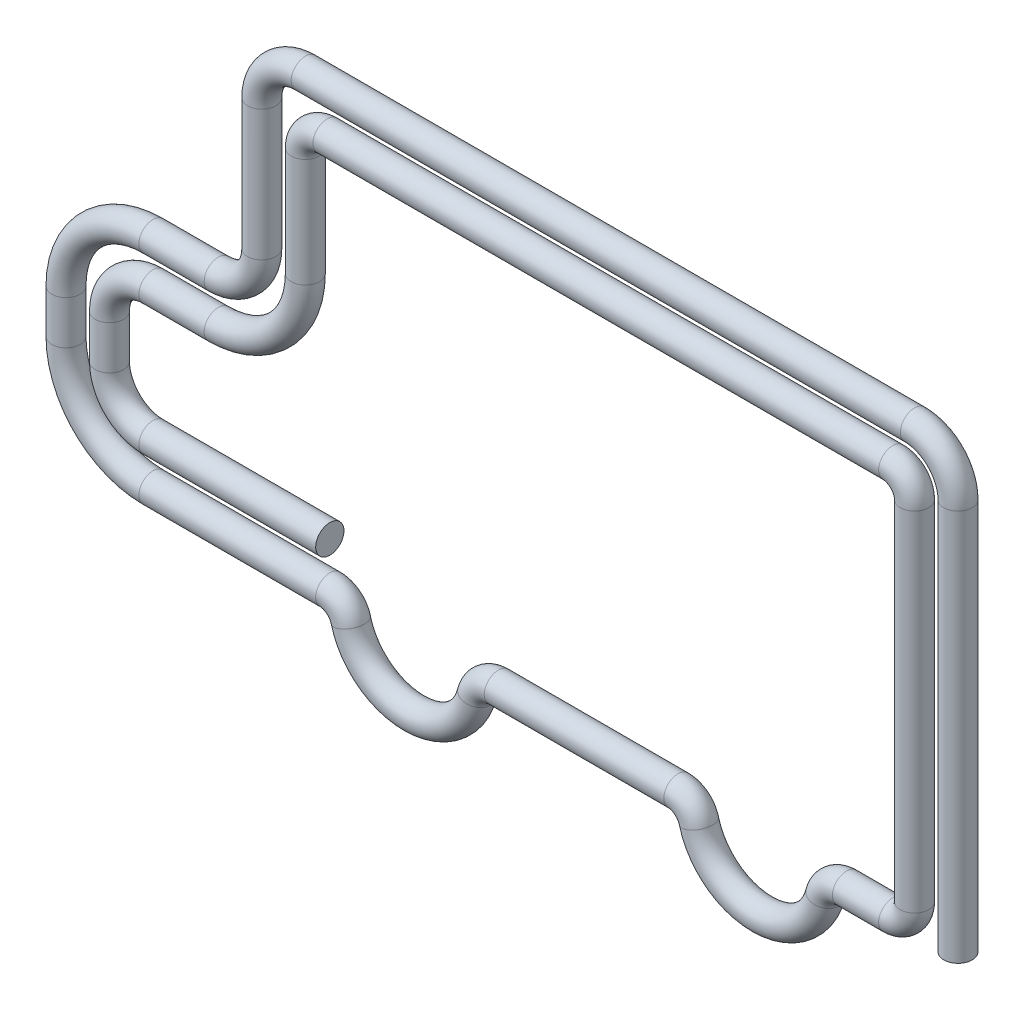
ISO-10303-21;
HEADER;
FILE_DESCRIPTION(('STEP AP214'),'2;1');
FILE_NAME('part.step','',(''),(''),'','','');
FILE_SCHEMA(('AUTOMOTIVE_DESIGN { 1 0 10303 214 1 1 1 1 }'));
ENDSEC;
DATA;
#1=APPLICATION_CONTEXT('core data for automotive mechanical design processes');
#2=APPLICATION_PROTOCOL_DEFINITION('international standard','automotive_design',2000,#1);
#3=PRODUCT_CONTEXT('',#1,'mechanical');
#4=PRODUCT('Part','Part','',(#3));
#5=PRODUCT_RELATED_PRODUCT_CATEGORY('part','',(#4));
#6=PRODUCT_DEFINITION_FORMATION('','',#4);
#7=PRODUCT_DEFINITION_CONTEXT('part definition',#1,'design');
#8=PRODUCT_DEFINITION('design','',#6,#7);
#9=PRODUCT_DEFINITION_SHAPE('','',#8);
#10=(LENGTH_UNIT() NAMED_UNIT(*) SI_UNIT(.MILLI.,.METRE.));
#11=(NAMED_UNIT(*) PLANE_ANGLE_UNIT() SI_UNIT($,.RADIAN.));
#12=(NAMED_UNIT(*) SI_UNIT($,.STERADIAN.) SOLID_ANGLE_UNIT());
#13=UNCERTAINTY_MEASURE_WITH_UNIT(LENGTH_MEASURE(1.E-05),#10,'distance_accuracy_value','');
#14=(GEOMETRIC_REPRESENTATION_CONTEXT(3) GLOBAL_UNCERTAINTY_ASSIGNED_CONTEXT((#13)) GLOBAL_UNIT_ASSIGNED_CONTEXT((#10,
#11,#12)) REPRESENTATION_CONTEXT('',''));
#15=CARTESIAN_POINT('',(0.,0.,0.));
#16=DIRECTION('',(0.,0.,1.));
#17=DIRECTION('',(1.,0.,0.));
#18=AXIS2_PLACEMENT_3D('',#15,#16,#17);
#19=CARTESIAN_POINT('',(-20.,-8.00000000000001,0.));
#20=DIRECTION('',(1.,0.,0.));
#21=DIRECTION('',(0.,1.,0.));
#22=AXIS2_PLACEMENT_3D('',#19,#20,#21);
#23=CYLINDRICAL_SURFACE('',#22,0.650000000000001);
#24=CARTESIAN_POINT('',(-20.,-8.00000000000001,0.));
#25=DIRECTION('',(-1.,-1.12581485517702E-13,0.));
#26=DIRECTION('',(1.12581485517702E-13,-1.,0.));
#27=AXIS2_PLACEMENT_3D('',#24,#25,#26);
#28=CIRCLE('',#27,0.650000000000001);
#29=CARTESIAN_POINT('',(-20.,-8.65000000000001,0.));
#30=VERTEX_POINT('',#29);
#31=EDGE_CURVE('E39',#30,#30,#28,.T.);
#32=ORIENTED_EDGE('',*,*,#31,.F.);
#33=EDGE_LOOP('',(#32));
#34=FACE_BOUND('',#33,.T.);
#35=CARTESIAN_POINT('',(-11.8729833462074,-8.00000000000001,0.));
#36=DIRECTION('',(-1.,-1.12581485517702E-13,0.));
#37=DIRECTION('',(1.12581485517702E-13,-1.,0.));
#38=AXIS2_PLACEMENT_3D('',#35,#36,#37);
#39=CIRCLE('',#38,0.650000000000001);
#40=CARTESIAN_POINT('',(-11.8729833462074,-8.65000000000001,0.));
#41=VERTEX_POINT('',#40);
#42=EDGE_CURVE('E10',#41,#41,#39,.T.);
#43=ORIENTED_EDGE('',*,*,#42,.T.);
#44=EDGE_LOOP('',(#43));
#45=FACE_BOUND('',#44,.T.);
#46=ADVANCED_FACE('F33',(#34,#45),#23,.T.);
#47=CARTESIAN_POINT('',(-20.,-6.,0.));
#48=DIRECTION('',(0.,0.,1.));
#49=DIRECTION('',(1.,0.,0.));
#50=AXIS2_PLACEMENT_3D('',#47,#48,#49);
#51=TOROIDAL_SURFACE('',#50,2.00000000000001,0.650000000000001);
#52=CARTESIAN_POINT('',(-22.,-5.99999999999997,0.));
#53=DIRECTION('',(0.,1.,0.));
#54=DIRECTION('',(-1.,0.,0.));
#55=AXIS2_PLACEMENT_3D('',#52,#53,#54);
#56=CIRCLE('',#55,0.650000000000001);
#57=CARTESIAN_POINT('',(-22.65,-5.99999999999995,0.));
#58=VERTEX_POINT('',#57);
#59=EDGE_CURVE('E43',#58,#58,#56,.T.);
#60=CARTESIAN_POINT('',(-20.,-6.,0.));
#61=DIRECTION('',(0.,0.,1.));
#62=DIRECTION('',(1.,0.,0.));
#63=AXIS2_PLACEMENT_3D('',#60,#61,#62);
#64=CIRCLE('',#63,2.65000000000001);
#65=EDGE_CURVE('',#58,#30,#64,.T.);
#66=ORIENTED_EDGE('',*,*,#59,.F.);
#67=ORIENTED_EDGE('',*,*,#31,.T.);
#68=ORIENTED_EDGE('',*,*,#65,.T.);
#69=ORIENTED_EDGE('',*,*,#65,.F.);
#70=EDGE_LOOP('',(#66,#68,#67,#69));
#71=FACE_BOUND('',#70,.T.);
#72=ADVANCED_FACE('F305',(#71),#51,.T.);
#73=CARTESIAN_POINT('',(-22.,-4.,0.));
#74=DIRECTION('',(0.,-1.,0.));
#75=DIRECTION('',(0.,0.,-1.));
#76=AXIS2_PLACEMENT_3D('',#73,#74,#75);
#77=CYLINDRICAL_SURFACE('',#76,0.650000000000001);
#78=CARTESIAN_POINT('',(-22.,-4.,0.));
#79=DIRECTION('',(0.,1.,0.));
#80=DIRECTION('',(-1.,0.,0.));
#81=AXIS2_PLACEMENT_3D('',#78,#79,#80);
#82=CIRCLE('',#81,0.650000000000001);
#83=CARTESIAN_POINT('',(-22.65,-4.,0.));
#84=VERTEX_POINT('',#83);
#85=EDGE_CURVE('E47',#84,#84,#82,.T.);
#86=ORIENTED_EDGE('',*,*,#85,.F.);
#87=EDGE_LOOP('',(#86));
#88=FACE_BOUND('',#87,.T.);
#89=ORIENTED_EDGE('',*,*,#59,.T.);
#90=EDGE_LOOP('',(#89));
#91=FACE_BOUND('',#90,.T.);
#92=ADVANCED_FACE('F299',(#88,#91),#77,.T.);
#93=CARTESIAN_POINT('',(-20.,-4.,0.));
#94=DIRECTION('',(0.,0.,1.));
#95=DIRECTION('',(1.,0.,0.));
#96=AXIS2_PLACEMENT_3D('',#93,#94,#95);
#97=TOROIDAL_SURFACE('',#96,2.00000000000001,0.650000000000001);
#98=CARTESIAN_POINT('',(-20.,-1.99999999999999,0.));
#99=DIRECTION('',(1.,0.,0.));
#100=DIRECTION('',(0.,1.,0.));
#101=AXIS2_PLACEMENT_3D('',#98,#99,#100);
#102=CIRCLE('',#101,0.650000000000001);
#103=CARTESIAN_POINT('',(-19.9999999999999,-1.34999999999999,0.));
#104=VERTEX_POINT('',#103);
#105=EDGE_CURVE('E52',#104,#104,#102,.T.);
#106=CARTESIAN_POINT('',(-20.,-4.,0.));
#107=DIRECTION('',(0.,0.,1.));
#108=DIRECTION('',(1.,0.,0.));
#109=AXIS2_PLACEMENT_3D('',#106,#107,#108);
#110=CIRCLE('',#109,2.65000000000001);
#111=EDGE_CURVE('',#104,#84,#110,.T.);
#112=ORIENTED_EDGE('',*,*,#105,.F.);
#113=ORIENTED_EDGE('',*,*,#85,.T.);
#114=ORIENTED_EDGE('',*,*,#111,.T.);
#115=ORIENTED_EDGE('',*,*,#111,.F.);
#116=EDGE_LOOP('',(#112,#114,#113,#115));
#117=FACE_BOUND('',#116,.T.);
#118=ADVANCED_FACE('F293',(#117),#97,.T.);
#119=CARTESIAN_POINT('',(-17.,-1.99999999999999,0.));
#120=DIRECTION('',(-1.,0.,0.));
#121=DIRECTION('',(0.,0.,1.));
#122=AXIS2_PLACEMENT_3D('',#119,#120,#121);
#123=CYLINDRICAL_SURFACE('',#122,0.650000000000001);
#124=CARTESIAN_POINT('',(-17.,-1.99999999999999,0.));
#125=DIRECTION('',(1.,0.,0.));
#126=DIRECTION('',(0.,1.,0.));
#127=AXIS2_PLACEMENT_3D('',#124,#125,#126);
#128=CIRCLE('',#127,0.650000000000001);
#129=CARTESIAN_POINT('',(-17.,-2.65,0.));
#130=VERTEX_POINT('',#129);
#131=EDGE_CURVE('E55',#130,#130,#128,.T.);
#132=ORIENTED_EDGE('',*,*,#131,.F.);
#133=EDGE_LOOP('',(#132));
#134=FACE_BOUND('',#133,.T.);
#135=ORIENTED_EDGE('',*,*,#105,.T.);
#136=EDGE_LOOP('',(#135));
#137=FACE_BOUND('',#136,.T.);
#138=ADVANCED_FACE('F287',(#134,#137),#123,.T.);
#139=CARTESIAN_POINT('',(-17.,2.,0.));
#140=DIRECTION('',(0.,0.,-1.));
#141=DIRECTION('',(-1.,0.,0.));
#142=AXIS2_PLACEMENT_3D('',#139,#140,#141);
#143=TOROIDAL_SURFACE('',#142,3.99999999999999,0.650000000000001);
#144=CARTESIAN_POINT('',(-13.,2.00000000000002,0.));
#145=DIRECTION('',(0.,1.,0.));
#146=DIRECTION('',(-1.,0.,0.));
#147=AXIS2_PLACEMENT_3D('',#144,#145,#146);
#148=CIRCLE('',#147,0.650000000000001);
#149=CARTESIAN_POINT('',(-12.35,2.00000000000003,0.));
#150=VERTEX_POINT('',#149);
#151=EDGE_CURVE('E58',#150,#150,#148,.T.);
#152=CARTESIAN_POINT('',(-17.,2.,0.));
#153=DIRECTION('',(0.,0.,-1.));
#154=DIRECTION('',(-1.,0.,0.));
#155=AXIS2_PLACEMENT_3D('',#152,#153,#154);
#156=CIRCLE('',#155,4.64999999999999);
#157=EDGE_CURVE('',#150,#130,#156,.T.);
#158=ORIENTED_EDGE('',*,*,#151,.F.);
#159=ORIENTED_EDGE('',*,*,#131,.T.);
#160=ORIENTED_EDGE('',*,*,#157,.T.);
#161=ORIENTED_EDGE('',*,*,#157,.F.);
#162=EDGE_LOOP('',(#158,#160,#159,#161));
#163=FACE_BOUND('',#162,.T.);
#164=ADVANCED_FACE('F281',(#163),#143,.T.);
#165=CARTESIAN_POINT('',(-13.,6.99999999999999,0.));
#166=DIRECTION('',(0.,-1.,0.));
#167=DIRECTION('',(0.,0.,-1.));
#168=AXIS2_PLACEMENT_3D('',#165,#166,#167);
#169=CYLINDRICAL_SURFACE('',#168,0.650000000000001);
#170=CARTESIAN_POINT('',(-13.,6.99999999999999,0.));
#171=DIRECTION('',(0.,1.,0.));
#172=DIRECTION('',(-1.,0.,0.));
#173=AXIS2_PLACEMENT_3D('',#170,#171,#172);
#174=CIRCLE('',#173,0.650000000000001);
#175=CARTESIAN_POINT('',(-13.65,6.99999999999999,0.));
#176=VERTEX_POINT('',#175);
#177=EDGE_CURVE('E61',#176,#176,#174,.T.);
#178=ORIENTED_EDGE('',*,*,#177,.F.);
#179=EDGE_LOOP('',(#178));
#180=FACE_BOUND('',#179,.T.);
#181=ORIENTED_EDGE('',*,*,#151,.T.);
#182=EDGE_LOOP('',(#181));
#183=FACE_BOUND('',#182,.T.);
#184=ADVANCED_FACE('F275',(#180,#183),#169,.T.);
#185=CARTESIAN_POINT('',(-12.,6.99999999999999,0.));
#186=DIRECTION('',(0.,0.,1.));
#187=DIRECTION('',(1.,0.,0.));
#188=AXIS2_PLACEMENT_3D('',#185,#186,#187);
#189=TOROIDAL_SURFACE('',#188,1.00000000000001,0.650000000000001);
#190=CARTESIAN_POINT('',(-12.,7.99999999999999,0.));
#191=DIRECTION('',(1.,0.,0.));
#192=DIRECTION('',(0.,1.,0.));
#193=AXIS2_PLACEMENT_3D('',#190,#191,#192);
#194=CIRCLE('',#193,0.650000000000001);
#195=CARTESIAN_POINT('',(-12.,8.65,0.));
#196=VERTEX_POINT('',#195);
#197=EDGE_CURVE('E64',#196,#196,#194,.T.);
#198=CARTESIAN_POINT('',(-12.,6.99999999999999,0.));
#199=DIRECTION('',(0.,0.,1.));
#200=DIRECTION('',(1.,0.,0.));
#201=AXIS2_PLACEMENT_3D('',#198,#199,#200);
#202=CIRCLE('',#201,1.65000000000001);
#203=EDGE_CURVE('',#196,#176,#202,.T.);
#204=ORIENTED_EDGE('',*,*,#197,.F.);
#205=ORIENTED_EDGE('',*,*,#177,.T.);
#206=ORIENTED_EDGE('',*,*,#203,.T.);
#207=ORIENTED_EDGE('',*,*,#203,.F.);
#208=EDGE_LOOP('',(#204,#206,#205,#207));
#209=FACE_BOUND('',#208,.T.);
#210=ADVANCED_FACE('F269',(#209),#189,.T.);
#211=CARTESIAN_POINT('',(14.,8.00000000000001,0.));
#212=DIRECTION('',(-1.,0.,0.));
#213=DIRECTION('',(0.,-1.,0.));
#214=AXIS2_PLACEMENT_3D('',#211,#212,#213);
#215=CYLINDRICAL_SURFACE('',#214,0.650000000000001);
#216=CARTESIAN_POINT('',(14.,8.00000000000001,0.));
#217=DIRECTION('',(1.,0.,0.));
#218=DIRECTION('',(0.,1.,0.));
#219=AXIS2_PLACEMENT_3D('',#216,#217,#218);
#220=CIRCLE('',#219,0.650000000000001);
#221=CARTESIAN_POINT('',(14.,8.65000000000001,0.));
#222=VERTEX_POINT('',#221);
#223=EDGE_CURVE('E67',#222,#222,#220,.T.);
#224=ORIENTED_EDGE('',*,*,#223,.F.);
#225=EDGE_LOOP('',(#224));
#226=FACE_BOUND('',#225,.T.);
#227=ORIENTED_EDGE('',*,*,#197,.T.);
#228=EDGE_LOOP('',(#227));
#229=FACE_BOUND('',#228,.T.);
#230=ADVANCED_FACE('F263',(#226,#229),#215,.T.);
#231=CARTESIAN_POINT('',(14.,7.,0.));
#232=DIRECTION('',(0.,0.,1.));
#233=DIRECTION('',(1.,0.,0.));
#234=AXIS2_PLACEMENT_3D('',#231,#232,#233);
#235=TOROIDAL_SURFACE('',#234,1.00000000000001,0.650000000000001);
#236=CARTESIAN_POINT('',(15.,6.99999999999998,0.));
#237=DIRECTION('',(0.,-1.,0.));
#238=DIRECTION('',(1.,0.,0.));
#239=AXIS2_PLACEMENT_3D('',#236,#237,#238);
#240=CIRCLE('',#239,0.650000000000001);
#241=CARTESIAN_POINT('',(15.65,6.99999999999997,0.));
#242=VERTEX_POINT('',#241);
#243=EDGE_CURVE('E70',#242,#242,#240,.T.);
#244=CARTESIAN_POINT('',(14.,7.,0.));
#245=DIRECTION('',(0.,0.,1.));
#246=DIRECTION('',(1.,0.,0.));
#247=AXIS2_PLACEMENT_3D('',#244,#245,#246);
#248=CIRCLE('',#247,1.65000000000001);
#249=EDGE_CURVE('',#242,#222,#248,.T.);
#250=ORIENTED_EDGE('',*,*,#243,.F.);
#251=ORIENTED_EDGE('',*,*,#223,.T.);
#252=ORIENTED_EDGE('',*,*,#249,.T.);
#253=ORIENTED_EDGE('',*,*,#249,.F.);
#254=EDGE_LOOP('',(#250,#252,#251,#253));
#255=FACE_BOUND('',#254,.T.);
#256=ADVANCED_FACE('F257',(#255),#235,.T.);
#257=CARTESIAN_POINT('',(15.,-9.00000000000001,0.));
#258=DIRECTION('',(0.,1.,0.));
#259=DIRECTION('',(-1.,0.,0.));
#260=AXIS2_PLACEMENT_3D('',#257,#258,#259);
#261=CYLINDRICAL_SURFACE('',#260,0.650000000000001);
#262=CARTESIAN_POINT('',(15.,-9.00000000000001,0.));
#263=DIRECTION('',(0.,-1.,0.));
#264=DIRECTION('',(1.,0.,0.));
#265=AXIS2_PLACEMENT_3D('',#262,#263,#264);
#266=CIRCLE('',#265,0.650000000000001);
#267=CARTESIAN_POINT('',(15.65,-9.00000000000001,0.));
#268=VERTEX_POINT('',#267);
#269=EDGE_CURVE('E73',#268,#268,#266,.T.);
#270=ORIENTED_EDGE('',*,*,#269,.F.);
#271=EDGE_LOOP('',(#270));
#272=FACE_BOUND('',#271,.T.);
#273=ORIENTED_EDGE('',*,*,#243,.T.);
#274=EDGE_LOOP('',(#273));
#275=FACE_BOUND('',#274,.T.);
#276=ADVANCED_FACE('F251',(#272,#275),#261,.T.);
#277=CARTESIAN_POINT('',(14.,-9.,0.));
#278=DIRECTION('',(0.,0.,1.));
#279=DIRECTION('',(1.,0.,0.));
#280=AXIS2_PLACEMENT_3D('',#277,#278,#279);
#281=TOROIDAL_SURFACE('',#280,1.00000000000001,0.650000000000001);
#282=CARTESIAN_POINT('',(14.,-10.,0.));
#283=DIRECTION('',(-1.,0.,0.));
#284=DIRECTION('',(0.,-1.,0.));
#285=AXIS2_PLACEMENT_3D('',#282,#283,#284);
#286=CIRCLE('',#285,0.650000000000001);
#287=CARTESIAN_POINT('',(14.,-10.65,0.));
#288=VERTEX_POINT('',#287);
#289=EDGE_CURVE('E76',#288,#288,#286,.T.);
#290=CARTESIAN_POINT('',(14.,-9.,0.));
#291=DIRECTION('',(0.,0.,1.));
#292=DIRECTION('',(1.,0.,0.));
#293=AXIS2_PLACEMENT_3D('',#290,#291,#292);
#294=CIRCLE('',#293,1.65000000000001);
#295=EDGE_CURVE('',#288,#268,#294,.T.);
#296=ORIENTED_EDGE('',*,*,#289,.F.);
#297=ORIENTED_EDGE('',*,*,#269,.T.);
#298=ORIENTED_EDGE('',*,*,#295,.T.);
#299=ORIENTED_EDGE('',*,*,#295,.F.);
#300=EDGE_LOOP('',(#296,#298,#297,#299));
#301=FACE_BOUND('',#300,.T.);
#302=ADVANCED_FACE('F245',(#301),#281,.T.);
#303=CARTESIAN_POINT('',(11.8729833462074,-10.,0.));
#304=DIRECTION('',(1.,0.,0.));
#305=DIRECTION('',(0.,1.,0.));
#306=AXIS2_PLACEMENT_3D('',#303,#304,#305);
#307=CYLINDRICAL_SURFACE('',#306,0.650000000000001);
#308=CARTESIAN_POINT('',(11.8729833462074,-10.,0.));
#309=DIRECTION('',(-1.,0.,0.));
#310=DIRECTION('',(0.,-1.,0.));
#311=AXIS2_PLACEMENT_3D('',#308,#309,#310);
#312=CIRCLE('',#311,0.650000000000001);
#313=CARTESIAN_POINT('',(11.8729833462074,-9.35000000000001,0.));
#314=VERTEX_POINT('',#313);
#315=EDGE_CURVE('E79',#314,#314,#312,.T.);
#316=ORIENTED_EDGE('',*,*,#315,.F.);
#317=EDGE_LOOP('',(#316));
#318=FACE_BOUND('',#317,.T.);
#319=ORIENTED_EDGE('',*,*,#289,.T.);
#320=EDGE_LOOP('',(#319));
#321=FACE_BOUND('',#320,.T.);
#322=ADVANCED_FACE('F239',(#318,#321),#307,.T.);
#323=CARTESIAN_POINT('',(11.8729833462074,-11.,0.));
#324=DIRECTION('',(0.,0.,-1.));
#325=DIRECTION('',(-1.,0.,0.));
#326=AXIS2_PLACEMENT_3D('',#323,#324,#325);
#327=TOROIDAL_SURFACE('',#326,0.999999999999993,0.650000000000001);
#328=CARTESIAN_POINT('',(10.9047375096556,-10.75,0.));
#329=DIRECTION('',(-0.24999999999996,-0.968245836551865,0.));
#330=DIRECTION('',(0.968245836551865,-0.24999999999996,0.));
#331=AXIS2_PLACEMENT_3D('',#328,#329,#330);
#332=CIRCLE('',#331,0.650000000000001);
#333=CARTESIAN_POINT('',(10.2753777158969,-10.5875,0.));
#334=VERTEX_POINT('',#333);
#335=EDGE_CURVE('E82',#334,#334,#332,.T.);
#336=CARTESIAN_POINT('',(11.8729833462074,-11.,0.));
#337=DIRECTION('',(0.,0.,-1.));
#338=DIRECTION('',(-1.,0.,0.));
#339=AXIS2_PLACEMENT_3D('',#336,#337,#338);
#340=CIRCLE('',#339,1.64999999999999);
#341=EDGE_CURVE('',#334,#314,#340,.T.);
#342=ORIENTED_EDGE('',*,*,#335,.F.);
#343=ORIENTED_EDGE('',*,*,#315,.T.);
#344=ORIENTED_EDGE('',*,*,#341,.T.);
#345=ORIENTED_EDGE('',*,*,#341,.F.);
#346=EDGE_LOOP('',(#342,#344,#343,#345));
#347=FACE_BOUND('',#346,.T.);
#348=ADVANCED_FACE('F233',(#347),#327,.T.);
#349=CARTESIAN_POINT('',(8.,-10.,0.));
#350=DIRECTION('',(0.,0.,1.));
#351=DIRECTION('',(1.,0.,0.));
#352=AXIS2_PLACEMENT_3D('',#349,#350,#351);
#353=TOROIDAL_SURFACE('',#352,3.00000000000001,0.650000000000001);
#354=CARTESIAN_POINT('',(5.09526249034442,-10.75,0.));
#355=DIRECTION('',(-0.25000000000004,0.968245836551844,0.));
#356=DIRECTION('',(-0.968245836551844,-0.25000000000004,0.));
#357=AXIS2_PLACEMENT_3D('',#354,#355,#356);
#358=CIRCLE('',#357,0.650000000000001);
#359=CARTESIAN_POINT('',(5.72462228410313,-10.5875,0.));
#360=VERTEX_POINT('',#359);
#361=EDGE_CURVE('E85',#360,#360,#358,.T.);
#362=ORIENTED_EDGE('',*,*,#361,.F.);
#363=EDGE_LOOP('',(#362));
#364=FACE_BOUND('',#363,.T.);
#365=ORIENTED_EDGE('',*,*,#335,.T.);
#366=EDGE_LOOP('',(#365));
#367=FACE_BOUND('',#366,.T.);
#368=ADVANCED_FACE('F227',(#364,#367),#353,.T.);
#369=CARTESIAN_POINT('',(4.12701665379258,-11.,0.));
#370=DIRECTION('',(0.,0.,-1.));
#371=DIRECTION('',(-1.,0.,0.));
#372=AXIS2_PLACEMENT_3D('',#369,#370,#371);
#373=TOROIDAL_SURFACE('',#372,0.999999999999994,0.650000000000001);
#374=CARTESIAN_POINT('',(4.12701665379257,-10.,0.));
#375=DIRECTION('',(-1.,0.,0.));
#376=DIRECTION('',(0.,-1.,0.));
#377=AXIS2_PLACEMENT_3D('',#374,#375,#376);
#378=CIRCLE('',#377,0.650000000000001);
#379=CARTESIAN_POINT('',(4.12701665379256,-9.35000000000001,0.));
#380=VERTEX_POINT('',#379);
#381=EDGE_CURVE('E88',#380,#380,#378,.T.);
#382=CARTESIAN_POINT('',(4.12701665379258,-11.,0.));
#383=DIRECTION('',(0.,0.,-1.));
#384=DIRECTION('',(-1.,0.,0.));
#385=AXIS2_PLACEMENT_3D('',#382,#383,#384);
#386=CIRCLE('',#385,1.64999999999999);
#387=EDGE_CURVE('',#380,#360,#386,.T.);
#388=ORIENTED_EDGE('',*,*,#381,.F.);
#389=ORIENTED_EDGE('',*,*,#361,.T.);
#390=ORIENTED_EDGE('',*,*,#387,.T.);
#391=ORIENTED_EDGE('',*,*,#387,.F.);
#392=EDGE_LOOP('',(#388,#390,#389,#391));
#393=FACE_BOUND('',#392,.T.);
#394=ADVANCED_FACE('F221',(#393),#373,.T.);
#395=CARTESIAN_POINT('',(-4.12701665379259,-10.,0.));
#396=DIRECTION('',(1.,0.,0.));
#397=DIRECTION('',(0.,0.,-1.));
#398=AXIS2_PLACEMENT_3D('',#395,#396,#397);
#399=CYLINDRICAL_SURFACE('',#398,0.650000000000001);
#400=CARTESIAN_POINT('',(-4.12701665379259,-10.,0.));
#401=DIRECTION('',(-1.,0.,0.));
#402=DIRECTION('',(0.,-1.,0.));
#403=AXIS2_PLACEMENT_3D('',#400,#401,#402);
#404=CIRCLE('',#403,0.650000000000001);
#405=CARTESIAN_POINT('',(-4.1270166537926,-9.35000000000001,0.));
#406=VERTEX_POINT('',#405);
#407=EDGE_CURVE('E91',#406,#406,#404,.T.);
#408=ORIENTED_EDGE('',*,*,#407,.F.);
#409=EDGE_LOOP('',(#408));
#410=FACE_BOUND('',#409,.T.);
#411=ORIENTED_EDGE('',*,*,#381,.T.);
#412=EDGE_LOOP('',(#411));
#413=FACE_BOUND('',#412,.T.);
#414=ADVANCED_FACE('F215',(#410,#413),#399,.T.);
#415=CARTESIAN_POINT('',(-4.12701665379258,-11.,0.));
#416=DIRECTION('',(0.,0.,-1.));
#417=DIRECTION('',(-1.,0.,0.));
#418=AXIS2_PLACEMENT_3D('',#415,#416,#417);
#419=TOROIDAL_SURFACE('',#418,0.999999999999996,0.650000000000001);
#420=CARTESIAN_POINT('',(-5.09526249034444,-10.75,0.));
#421=DIRECTION('',(-0.249999999999959,-0.968245836551865,0.));
#422=DIRECTION('',(0.968245836551865,-0.249999999999959,0.));
#423=AXIS2_PLACEMENT_3D('',#420,#421,#422);
#424=CIRCLE('',#423,0.650000000000001);
#425=CARTESIAN_POINT('',(-5.72462228410314,-10.5875,0.));
#426=VERTEX_POINT('',#425);
#427=EDGE_CURVE('E94',#426,#426,#424,.T.);
#428=CARTESIAN_POINT('',(-4.12701665379258,-11.,0.));
#429=DIRECTION('',(0.,0.,-1.));
#430=DIRECTION('',(-1.,0.,0.));
#431=AXIS2_PLACEMENT_3D('',#428,#429,#430);
#432=CIRCLE('',#431,1.65);
#433=EDGE_CURVE('',#426,#406,#432,.T.);
#434=ORIENTED_EDGE('',*,*,#427,.F.);
#435=ORIENTED_EDGE('',*,*,#407,.T.);
#436=ORIENTED_EDGE('',*,*,#433,.T.);
#437=ORIENTED_EDGE('',*,*,#433,.F.);
#438=EDGE_LOOP('',(#434,#436,#435,#437));
#439=FACE_BOUND('',#438,.T.);
#440=ADVANCED_FACE('F209',(#439),#419,.T.);
#441=CARTESIAN_POINT('',(-8.,-10.,0.));
#442=DIRECTION('',(0.,0.,1.));
#443=DIRECTION('',(1.,0.,0.));
#444=AXIS2_PLACEMENT_3D('',#441,#442,#443);
#445=TOROIDAL_SURFACE('',#444,3.00000000000001,0.650000000000001);
#446=CARTESIAN_POINT('',(-10.9047375096556,-10.75,0.));
#447=DIRECTION('',(-0.25000000000004,0.968245836551844,0.));
#448=DIRECTION('',(-0.968245836551844,-0.25000000000004,0.));
#449=AXIS2_PLACEMENT_3D('',#446,#447,#448);
#450=CIRCLE('',#449,0.650000000000001);
#451=CARTESIAN_POINT('',(-10.2753777158969,-10.5875,0.));
#452=VERTEX_POINT('',#451);
#453=EDGE_CURVE('E97',#452,#452,#450,.T.);
#454=ORIENTED_EDGE('',*,*,#453,.F.);
#455=EDGE_LOOP('',(#454));
#456=FACE_BOUND('',#455,.T.);
#457=ORIENTED_EDGE('',*,*,#427,.T.);
#458=EDGE_LOOP('',(#457));
#459=FACE_BOUND('',#458,.T.);
#460=ADVANCED_FACE('F203',(#456,#459),#445,.T.);
#461=CARTESIAN_POINT('',(-11.8729833462074,-11.,0.));
#462=DIRECTION('',(0.,0.,-1.));
#463=DIRECTION('',(-1.,0.,0.));
#464=AXIS2_PLACEMENT_3D('',#461,#462,#463);
#465=TOROIDAL_SURFACE('',#464,0.999999999999996,0.650000000000001);
#466=CARTESIAN_POINT('',(-11.8729833462074,-10.,0.));
#467=DIRECTION('',(-1.,0.,0.));
#468=DIRECTION('',(0.,-1.,0.));
#469=AXIS2_PLACEMENT_3D('',#466,#467,#468);
#470=CIRCLE('',#469,0.650000000000001);
#471=CARTESIAN_POINT('',(-11.8729833462074,-9.35,0.));
#472=VERTEX_POINT('',#471);
#473=EDGE_CURVE('E100',#472,#472,#470,.T.);
#474=CARTESIAN_POINT('',(-11.8729833462074,-11.,0.));
#475=DIRECTION('',(0.,0.,-1.));
#476=DIRECTION('',(-1.,0.,0.));
#477=AXIS2_PLACEMENT_3D('',#474,#475,#476);
#478=CIRCLE('',#477,1.65);
#479=EDGE_CURVE('',#472,#452,#478,.T.);
#480=ORIENTED_EDGE('',*,*,#473,.F.);
#481=ORIENTED_EDGE('',*,*,#453,.T.);
#482=ORIENTED_EDGE('',*,*,#479,.T.);
#483=ORIENTED_EDGE('',*,*,#479,.F.);
#484=EDGE_LOOP('',(#480,#482,#481,#483));
#485=FACE_BOUND('',#484,.T.);
#486=ADVANCED_FACE('F197',(#485),#465,.T.);
#487=CARTESIAN_POINT('',(-20.,-10.,0.));
#488=DIRECTION('',(1.,0.,0.));
#489=DIRECTION('',(0.,1.,0.));
#490=AXIS2_PLACEMENT_3D('',#487,#488,#489);
#491=CYLINDRICAL_SURFACE('',#490,0.650000000000001);
#492=CARTESIAN_POINT('',(-20.,-10.,0.));
#493=DIRECTION('',(-1.,0.,0.));
#494=DIRECTION('',(0.,-1.,0.));
#495=AXIS2_PLACEMENT_3D('',#492,#493,#494);
#496=CIRCLE('',#495,0.650000000000001);
#497=CARTESIAN_POINT('',(-20.,-10.65,0.));
#498=VERTEX_POINT('',#497);
#499=EDGE_CURVE('E103',#498,#498,#496,.T.);
#500=ORIENTED_EDGE('',*,*,#499,.F.);
#501=EDGE_LOOP('',(#500));
#502=FACE_BOUND('',#501,.T.);
#503=ORIENTED_EDGE('',*,*,#473,.T.);
#504=EDGE_LOOP('',(#503));
#505=FACE_BOUND('',#504,.T.);
#506=ADVANCED_FACE('F191',(#502,#505),#491,.T.);
#507=CARTESIAN_POINT('',(-20.,-6.,0.));
#508=DIRECTION('',(0.,0.,1.));
#509=DIRECTION('',(1.,0.,0.));
#510=AXIS2_PLACEMENT_3D('',#507,#508,#509);
#511=TOROIDAL_SURFACE('',#510,4.,0.650000000000001);
#512=CARTESIAN_POINT('',(-24.,-5.99999999999997,0.));
#513=DIRECTION('',(0.,1.,0.));
#514=DIRECTION('',(-1.,0.,0.));
#515=AXIS2_PLACEMENT_3D('',#512,#513,#514);
#516=CIRCLE('',#515,0.650000000000001);
#517=CARTESIAN_POINT('',(-24.65,-5.99999999999997,0.));
#518=VERTEX_POINT('',#517);
#519=EDGE_CURVE('E106',#518,#518,#516,.T.);
#520=CARTESIAN_POINT('',(-20.,-6.,0.));
#521=DIRECTION('',(0.,0.,1.));
#522=DIRECTION('',(1.,0.,0.));
#523=AXIS2_PLACEMENT_3D('',#520,#521,#522);
#524=CIRCLE('',#523,4.65);
#525=EDGE_CURVE('',#518,#498,#524,.T.);
#526=ORIENTED_EDGE('',*,*,#519,.F.);
#527=ORIENTED_EDGE('',*,*,#499,.T.);
#528=ORIENTED_EDGE('',*,*,#525,.T.);
#529=ORIENTED_EDGE('',*,*,#525,.F.);
#530=EDGE_LOOP('',(#526,#528,#527,#529));
#531=FACE_BOUND('',#530,.T.);
#532=ADVANCED_FACE('F185',(#531),#511,.T.);
#533=CARTESIAN_POINT('',(-24.,-4.00000000000002,0.));
#534=DIRECTION('',(0.,-1.,0.));
#535=DIRECTION('',(0.,0.,-1.));
#536=AXIS2_PLACEMENT_3D('',#533,#534,#535);
#537=CYLINDRICAL_SURFACE('',#536,0.650000000000001);
#538=CARTESIAN_POINT('',(-24.,-4.00000000000002,0.));
#539=DIRECTION('',(0.,1.,0.));
#540=DIRECTION('',(-1.,0.,0.));
#541=AXIS2_PLACEMENT_3D('',#538,#539,#540);
#542=CIRCLE('',#541,0.650000000000001);
#543=CARTESIAN_POINT('',(-24.65,-4.00000000000002,0.));
#544=VERTEX_POINT('',#543);
#545=EDGE_CURVE('E109',#544,#544,#542,.T.);
#546=ORIENTED_EDGE('',*,*,#545,.F.);
#547=EDGE_LOOP('',(#546));
#548=FACE_BOUND('',#547,.T.);
#549=ORIENTED_EDGE('',*,*,#519,.T.);
#550=EDGE_LOOP('',(#549));
#551=FACE_BOUND('',#550,.T.);
#552=ADVANCED_FACE('F179',(#548,#551),#537,.T.);
#553=CARTESIAN_POINT('',(-20.,-4.,0.));
#554=DIRECTION('',(0.,0.,1.));
#555=DIRECTION('',(1.,0.,0.));
#556=AXIS2_PLACEMENT_3D('',#553,#554,#555);
#557=TOROIDAL_SURFACE('',#556,4.00000000000001,0.650000000000001);
#558=CARTESIAN_POINT('',(-20.,0.,0.));
#559=DIRECTION('',(1.,0.,0.));
#560=DIRECTION('',(0.,1.,0.));
#561=AXIS2_PLACEMENT_3D('',#558,#559,#560);
#562=CIRCLE('',#561,0.650000000000001);
#563=CARTESIAN_POINT('',(-20.,0.650000000000005,0.));
#564=VERTEX_POINT('',#563);
#565=EDGE_CURVE('E112',#564,#564,#562,.T.);
#566=CARTESIAN_POINT('',(-20.,-4.,0.));
#567=DIRECTION('',(0.,0.,1.));
#568=DIRECTION('',(1.,0.,0.));
#569=AXIS2_PLACEMENT_3D('',#566,#567,#568);
#570=CIRCLE('',#569,4.65000000000001);
#571=EDGE_CURVE('',#564,#544,#570,.T.);
#572=ORIENTED_EDGE('',*,*,#565,.F.);
#573=ORIENTED_EDGE('',*,*,#545,.T.);
#574=ORIENTED_EDGE('',*,*,#571,.T.);
#575=ORIENTED_EDGE('',*,*,#571,.F.);
#576=EDGE_LOOP('',(#572,#574,#573,#575));
#577=FACE_BOUND('',#576,.T.);
#578=ADVANCED_FACE('F173',(#577),#557,.T.);
#579=CARTESIAN_POINT('',(-17.,0.,0.));
#580=DIRECTION('',(-1.,0.,0.));
#581=DIRECTION('',(0.,-1.,0.));
#582=AXIS2_PLACEMENT_3D('',#579,#580,#581);
#583=CYLINDRICAL_SURFACE('',#582,0.650000000000001);
#584=CARTESIAN_POINT('',(-17.,0.,0.));
#585=DIRECTION('',(1.,0.,0.));
#586=DIRECTION('',(0.,1.,0.));
#587=AXIS2_PLACEMENT_3D('',#584,#585,#586);
#588=CIRCLE('',#587,0.650000000000001);
#589=CARTESIAN_POINT('',(-17.,-0.649999999999999,0.));
#590=VERTEX_POINT('',#589);
#591=EDGE_CURVE('E115',#590,#590,#588,.T.);
#592=ORIENTED_EDGE('',*,*,#591,.F.);
#593=EDGE_LOOP('',(#592));
#594=FACE_BOUND('',#593,.T.);
#595=ORIENTED_EDGE('',*,*,#565,.T.);
#596=EDGE_LOOP('',(#595));
#597=FACE_BOUND('',#596,.T.);
#598=ADVANCED_FACE('F167',(#594,#597),#583,.T.);
#599=CARTESIAN_POINT('',(-17.,2.,0.));
#600=DIRECTION('',(0.,0.,-1.));
#601=DIRECTION('',(-1.,0.,0.));
#602=AXIS2_PLACEMENT_3D('',#599,#600,#601);
#603=TOROIDAL_SURFACE('',#602,2.,0.650000000000001);
#604=CARTESIAN_POINT('',(-15.,2.00000000000002,0.));
#605=DIRECTION('',(0.,1.,0.));
#606=DIRECTION('',(-1.,0.,0.));
#607=AXIS2_PLACEMENT_3D('',#604,#605,#606);
#608=CIRCLE('',#607,0.650000000000001);
#609=CARTESIAN_POINT('',(-14.35,2.00000000000003,0.));
#610=VERTEX_POINT('',#609);
#611=EDGE_CURVE('E118',#610,#610,#608,.T.);
#612=CARTESIAN_POINT('',(-17.,2.,0.));
#613=DIRECTION('',(0.,0.,-1.));
#614=DIRECTION('',(-1.,0.,0.));
#615=AXIS2_PLACEMENT_3D('',#612,#613,#614);
#616=CIRCLE('',#615,2.65);
#617=EDGE_CURVE('',#610,#590,#616,.T.);
#618=ORIENTED_EDGE('',*,*,#611,.F.);
#619=ORIENTED_EDGE('',*,*,#591,.T.);
#620=ORIENTED_EDGE('',*,*,#617,.T.);
#621=ORIENTED_EDGE('',*,*,#617,.F.);
#622=EDGE_LOOP('',(#618,#620,#619,#621));
#623=FACE_BOUND('',#622,.T.);
#624=ADVANCED_FACE('F161',(#623),#603,.T.);
#625=CARTESIAN_POINT('',(-15.,7.99999999999999,0.));
#626=DIRECTION('',(0.,-1.,0.));
#627=DIRECTION('',(0.,0.,-1.));
#628=AXIS2_PLACEMENT_3D('',#625,#626,#627);
#629=CYLINDRICAL_SURFACE('',#628,0.650000000000001);
#630=CARTESIAN_POINT('',(-15.,7.99999999999999,0.));
#631=DIRECTION('',(0.,1.,0.));
#632=DIRECTION('',(-1.,0.,0.));
#633=AXIS2_PLACEMENT_3D('',#630,#631,#632);
#634=CIRCLE('',#633,0.650000000000001);
#635=CARTESIAN_POINT('',(-15.65,7.99999999999999,0.));
#636=VERTEX_POINT('',#635);
#637=EDGE_CURVE('E121',#636,#636,#634,.T.);
#638=ORIENTED_EDGE('',*,*,#637,.F.);
#639=EDGE_LOOP('',(#638));
#640=FACE_BOUND('',#639,.T.);
#641=ORIENTED_EDGE('',*,*,#611,.T.);
#642=EDGE_LOOP('',(#641));
#643=FACE_BOUND('',#642,.T.);
#644=ADVANCED_FACE('F155',(#640,#643),#629,.T.);
#645=CARTESIAN_POINT('',(-13.,8.,0.));
#646=DIRECTION('',(0.,0.,1.));
#647=DIRECTION('',(1.,0.,0.));
#648=AXIS2_PLACEMENT_3D('',#645,#646,#647);
#649=TOROIDAL_SURFACE('',#648,2.,0.650000000000001);
#650=CARTESIAN_POINT('',(-13.,10.,0.));
#651=DIRECTION('',(1.,0.,0.));
#652=DIRECTION('',(0.,1.,0.));
#653=AXIS2_PLACEMENT_3D('',#650,#651,#652);
#654=CIRCLE('',#653,0.650000000000001);
#655=CARTESIAN_POINT('',(-13.,10.65,0.));
#656=VERTEX_POINT('',#655);
#657=EDGE_CURVE('E124',#656,#656,#654,.T.);
#658=CARTESIAN_POINT('',(-13.,8.,0.));
#659=DIRECTION('',(0.,0.,1.));
#660=DIRECTION('',(1.,0.,0.));
#661=AXIS2_PLACEMENT_3D('',#658,#659,#660);
#662=CIRCLE('',#661,2.65);
#663=EDGE_CURVE('',#656,#636,#662,.T.);
#664=ORIENTED_EDGE('',*,*,#657,.F.);
#665=ORIENTED_EDGE('',*,*,#637,.T.);
#666=ORIENTED_EDGE('',*,*,#663,.T.);
#667=ORIENTED_EDGE('',*,*,#663,.F.);
#668=EDGE_LOOP('',(#664,#666,#665,#667));
#669=FACE_BOUND('',#668,.T.);
#670=ADVANCED_FACE('F149',(#669),#649,.T.);
#671=CARTESIAN_POINT('',(15.,10.,0.));
#672=DIRECTION('',(-1.,0.,0.));
#673=DIRECTION('',(0.,-1.,0.));
#674=AXIS2_PLACEMENT_3D('',#671,#672,#673);
#675=CYLINDRICAL_SURFACE('',#674,0.650000000000001);
#676=CARTESIAN_POINT('',(15.,10.,0.));
#677=DIRECTION('',(1.,0.,0.));
#678=DIRECTION('',(0.,1.,0.));
#679=AXIS2_PLACEMENT_3D('',#676,#677,#678);
#680=CIRCLE('',#679,0.650000000000001);
#681=CARTESIAN_POINT('',(15.,10.65,0.));
#682=VERTEX_POINT('',#681);
#683=EDGE_CURVE('E127',#682,#682,#680,.T.);
#684=ORIENTED_EDGE('',*,*,#683,.F.);
#685=EDGE_LOOP('',(#684));
#686=FACE_BOUND('',#685,.T.);
#687=ORIENTED_EDGE('',*,*,#657,.T.);
#688=EDGE_LOOP('',(#687));
#689=FACE_BOUND('',#688,.T.);
#690=ADVANCED_FACE('F143',(#686,#689),#675,.T.);
#691=CARTESIAN_POINT('',(15.,8.,0.));
#692=DIRECTION('',(0.,0.,1.));
#693=DIRECTION('',(1.,0.,0.));
#694=AXIS2_PLACEMENT_3D('',#691,#692,#693);
#695=TOROIDAL_SURFACE('',#694,2.,0.650000000000001);
#696=CARTESIAN_POINT('',(17.,7.99999999999999,0.));
#697=DIRECTION('',(0.,-1.,0.));
#698=DIRECTION('',(1.,0.,0.));
#699=AXIS2_PLACEMENT_3D('',#696,#697,#698);
#700=CIRCLE('',#699,0.650000000000001);
#701=CARTESIAN_POINT('',(17.65,7.99999999999998,0.));
#702=VERTEX_POINT('',#701);
#703=EDGE_CURVE('E130',#702,#702,#700,.T.);
#704=CARTESIAN_POINT('',(15.,8.,0.));
#705=DIRECTION('',(0.,0.,1.));
#706=DIRECTION('',(1.,0.,0.));
#707=AXIS2_PLACEMENT_3D('',#704,#705,#706);
#708=CIRCLE('',#707,2.65);
#709=EDGE_CURVE('',#702,#682,#708,.T.);
#710=ORIENTED_EDGE('',*,*,#703,.F.);
#711=ORIENTED_EDGE('',*,*,#683,.T.);
#712=ORIENTED_EDGE('',*,*,#709,.T.);
#713=ORIENTED_EDGE('',*,*,#709,.F.);
#714=EDGE_LOOP('',(#710,#712,#711,#713));
#715=FACE_BOUND('',#714,.T.);
#716=ADVANCED_FACE('F140',(#715),#695,.T.);
#717=CARTESIAN_POINT('',(17.,7.99999999999999,0.));
#718=DIRECTION('',(0.,-1.,0.));
#719=DIRECTION('',(1.,0.,0.));
#720=AXIS2_PLACEMENT_3D('',#717,#718,#719);
#721=CYLINDRICAL_SURFACE('',#720,0.650000000000001);
#722=ORIENTED_EDGE('',*,*,#703,.T.);
#723=EDGE_LOOP('',(#722));
#724=FACE_BOUND('',#723,.T.);
#725=CARTESIAN_POINT('',(17.,-10.,0.));
#726=DIRECTION('',(0.,-1.,0.));
#727=DIRECTION('',(1.,0.,0.));
#728=AXIS2_PLACEMENT_3D('',#725,#726,#727);
#729=CIRCLE('',#728,0.650000000000001);
#730=CARTESIAN_POINT('',(17.65,-10.,0.));
#731=VERTEX_POINT('',#730);
#732=EDGE_CURVE('E131',#731,#731,#729,.T.);
#733=ORIENTED_EDGE('',*,*,#732,.F.);
#734=EDGE_LOOP('',(#733));
#735=FACE_BOUND('',#734,.T.);
#736=ADVANCED_FACE('F137',(#724,#735),#721,.T.);
#737=CARTESIAN_POINT('',(-11.8729833462074,-8.00000000000001,0.));
#738=DIRECTION('',(-1.,-1.12581485517702E-13,0.));
#739=DIRECTION('',(1.12581485517702E-13,-1.,0.));
#740=AXIS2_PLACEMENT_3D('',#737,#738,#739);
#741=PLANE('',#740);
#742=ORIENTED_EDGE('',*,*,#42,.F.);
#743=EDGE_LOOP('',(#742));
#744=FACE_BOUND('',#743,.T.);
#745=ADVANCED_FACE('F317',(#744),#741,.F.);
#746=CARTESIAN_POINT('',(17.,-10.,0.));
#747=DIRECTION('',(0.,-1.,0.));
#748=DIRECTION('',(1.,0.,0.));
#749=AXIS2_PLACEMENT_3D('',#746,#747,#748);
#750=PLANE('',#749);
#751=ORIENTED_EDGE('',*,*,#732,.T.);
#752=EDGE_LOOP('',(#751));
#753=FACE_BOUND('',#752,.T.);
#754=ADVANCED_FACE('F318',(#753),#750,.T.);
#755=CLOSED_SHELL('',(#46,#72,#92,#118,#138,#164,#184,#210,#230,#256,#276,#302,#322,#348,#368,
#394,#414,#440,#460,#486,#506,#532,#552,#578,#598,#624,#644,#670,#690,#716,#736,#745,#754));
#756=MANIFOLD_SOLID_BREP('B2',#755);
#757=ADVANCED_BREP_SHAPE_REPRESENTATION('',(#18,#756),#14);
#758=SHAPE_DEFINITION_REPRESENTATION(#9,#757);
ENDSEC;
END-ISO-10303-21;
